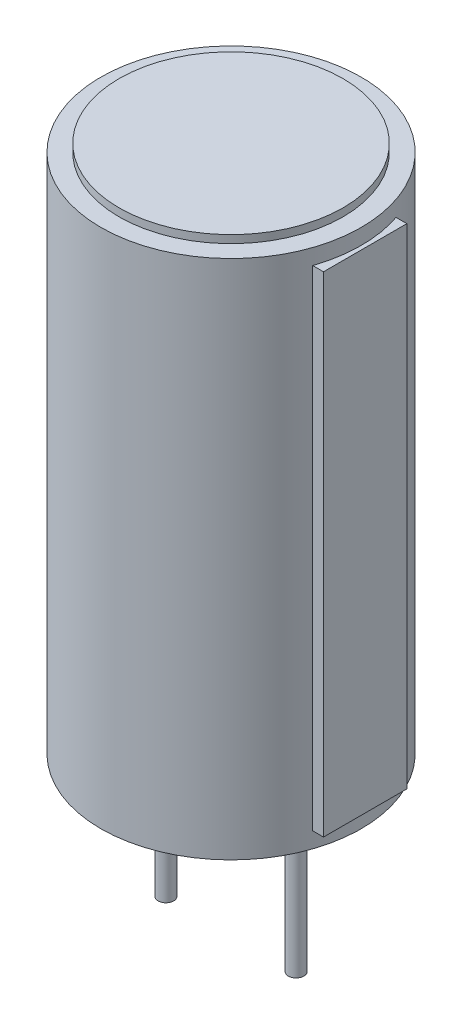
ISO-10303-21;
HEADER;
FILE_DESCRIPTION(('STEP AP214'),'2;1');
FILE_NAME('part.step','',(''),(''),'','','');
FILE_SCHEMA(('AUTOMOTIVE_DESIGN { 1 0 10303 214 1 1 1 1 }'));
ENDSEC;
DATA;
#1=APPLICATION_CONTEXT('core data for automotive mechanical design processes');
#2=APPLICATION_PROTOCOL_DEFINITION('international standard','automotive_design',2000,#1);
#3=PRODUCT_CONTEXT('',#1,'mechanical');
#4=PRODUCT('Part','Part','',(#3));
#5=PRODUCT_RELATED_PRODUCT_CATEGORY('part','',(#4));
#6=PRODUCT_DEFINITION_FORMATION('','',#4);
#7=PRODUCT_DEFINITION_CONTEXT('part definition',#1,'design');
#8=PRODUCT_DEFINITION('design','',#6,#7);
#9=PRODUCT_DEFINITION_SHAPE('','',#8);
#10=(LENGTH_UNIT() NAMED_UNIT(*) SI_UNIT(.MILLI.,.METRE.));
#11=(NAMED_UNIT(*) PLANE_ANGLE_UNIT() SI_UNIT($,.RADIAN.));
#12=(NAMED_UNIT(*) SI_UNIT($,.STERADIAN.) SOLID_ANGLE_UNIT());
#13=UNCERTAINTY_MEASURE_WITH_UNIT(LENGTH_MEASURE(1.E-05),#10,'distance_accuracy_value','');
#14=(GEOMETRIC_REPRESENTATION_CONTEXT(3) GLOBAL_UNCERTAINTY_ASSIGNED_CONTEXT((#13)) GLOBAL_UNIT_ASSIGNED_CONTEXT((#10,
#11,#12)) REPRESENTATION_CONTEXT('',''));
#15=CARTESIAN_POINT('',(0.,0.,0.));
#16=DIRECTION('',(0.,0.,1.));
#17=DIRECTION('',(1.,0.,0.));
#18=AXIS2_PLACEMENT_3D('',#15,#16,#17);
#19=CARTESIAN_POINT('',(2.5,0.,0.));
#20=DIRECTION('',(0.,-1.,0.));
#21=DIRECTION('',(0.,0.,-1.));
#22=AXIS2_PLACEMENT_3D('',#19,#20,#21);
#23=CYLINDRICAL_SURFACE('',#22,0.3);
#24=CARTESIAN_POINT('',(2.5,0.,0.));
#25=DIRECTION('',(0.,1.,0.));
#26=DIRECTION('',(0.,0.,1.));
#27=AXIS2_PLACEMENT_3D('',#24,#25,#26);
#28=CIRCLE('',#27,0.3);
#29=CARTESIAN_POINT('',(2.5,0.,0.3));
#30=VERTEX_POINT('',#29);
#31=EDGE_CURVE('E59',#30,#30,#28,.T.);
#32=ORIENTED_EDGE('',*,*,#31,.F.);
#33=EDGE_LOOP('',(#32));
#34=FACE_BOUND('',#33,.T.);
#35=CARTESIAN_POINT('',(2.5,-6.,0.));
#36=DIRECTION('',(0.,1.,0.));
#37=DIRECTION('',(0.,0.,1.));
#38=AXIS2_PLACEMENT_3D('',#35,#36,#37);
#39=CIRCLE('',#38,0.3);
#40=CARTESIAN_POINT('',(2.5,-6.,0.3));
#41=VERTEX_POINT('',#40);
#42=EDGE_CURVE('E11',#41,#41,#39,.T.);
#43=ORIENTED_EDGE('',*,*,#42,.T.);
#44=EDGE_LOOP('',(#43));
#45=FACE_BOUND('',#44,.T.);
#46=ADVANCED_FACE('F53',(#34,#45),#23,.T.);
#47=CARTESIAN_POINT('',(2.5,0.,0.));
#48=DIRECTION('',(0.,1.,0.));
#49=DIRECTION('',(0.,0.,1.));
#50=AXIS2_PLACEMENT_3D('',#47,#48,#49);
#51=PLANE('',#50);
#52=ORIENTED_EDGE('',*,*,#31,.T.);
#53=EDGE_LOOP('',(#52));
#54=FACE_BOUND('',#53,.T.);
#55=ADVANCED_FACE('F57',(#54),#51,.T.);
#56=CARTESIAN_POINT('',(2.5,-6.,0.));
#57=DIRECTION('',(0.,1.,0.));
#58=DIRECTION('',(0.,0.,1.));
#59=AXIS2_PLACEMENT_3D('',#56,#57,#58);
#60=PLANE('',#59);
#61=ORIENTED_EDGE('',*,*,#42,.F.);
#62=EDGE_LOOP('',(#61));
#63=FACE_BOUND('',#62,.T.);
#64=ADVANCED_FACE('F71',(#63),#60,.F.);
#65=CLOSED_SHELL('',(#46,#55,#64));
#66=MANIFOLD_SOLID_BREP('B2',#65);
#67=CARTESIAN_POINT('',(-2.5,0.,0.));
#68=DIRECTION('',(0.,-1.,0.));
#69=DIRECTION('',(0.,0.,-1.));
#70=AXIS2_PLACEMENT_3D('',#67,#68,#69);
#71=CYLINDRICAL_SURFACE('',#70,0.3);
#72=CARTESIAN_POINT('',(-2.5,0.,0.));
#73=DIRECTION('',(0.,1.,0.));
#74=DIRECTION('',(0.,0.,1.));
#75=AXIS2_PLACEMENT_3D('',#72,#73,#74);
#76=CIRCLE('',#75,0.3);
#77=CARTESIAN_POINT('',(-2.5,0.,0.3));
#78=VERTEX_POINT('',#77);
#79=EDGE_CURVE('E52',#78,#78,#76,.T.);
#80=ORIENTED_EDGE('',*,*,#79,.F.);
#81=EDGE_LOOP('',(#80));
#82=FACE_BOUND('',#81,.T.);
#83=CARTESIAN_POINT('',(-2.5,-6.,0.));
#84=DIRECTION('',(0.,1.,0.));
#85=DIRECTION('',(0.,0.,1.));
#86=AXIS2_PLACEMENT_3D('',#83,#84,#85);
#87=CIRCLE('',#86,0.3);
#88=CARTESIAN_POINT('',(-2.5,-6.,0.3));
#89=VERTEX_POINT('',#88);
#90=EDGE_CURVE('E117',#89,#89,#87,.T.);
#91=ORIENTED_EDGE('',*,*,#90,.T.);
#92=EDGE_LOOP('',(#91));
#93=FACE_BOUND('',#92,.T.);
#94=ADVANCED_FACE('F116',(#82,#93),#71,.T.);
#95=CARTESIAN_POINT('',(-2.5,0.,0.));
#96=DIRECTION('',(0.,1.,0.));
#97=DIRECTION('',(0.,0.,1.));
#98=AXIS2_PLACEMENT_3D('',#95,#96,#97);
#99=PLANE('',#98);
#100=ORIENTED_EDGE('',*,*,#79,.T.);
#101=EDGE_LOOP('',(#100));
#102=FACE_BOUND('',#101,.T.);
#103=ADVANCED_FACE('F131',(#102),#99,.T.);
#104=CARTESIAN_POINT('',(-2.5,-6.,0.));
#105=DIRECTION('',(0.,1.,0.));
#106=DIRECTION('',(0.,0.,1.));
#107=AXIS2_PLACEMENT_3D('',#104,#105,#106);
#108=PLANE('',#107);
#109=ORIENTED_EDGE('',*,*,#90,.F.);
#110=EDGE_LOOP('',(#109));
#111=FACE_BOUND('',#110,.T.);
#112=ADVANCED_FACE('F128',(#111),#108,.F.);
#113=CLOSED_SHELL('',(#94,#103,#112));
#114=MANIFOLD_SOLID_BREP('B6',#113);
#115=CARTESIAN_POINT('',(4.6,19.4,-1.6));
#116=DIRECTION('',(1.,0.,0.));
#117=DIRECTION('',(0.,0.,-1.));
#118=AXIS2_PLACEMENT_3D('',#115,#116,#117);
#119=PLANE('',#118);
#120=DIRECTION('',(0.,0.,1.));
#121=VECTOR('',#120,1.);
#122=CARTESIAN_POINT('',(4.6,0.6,-1.6));
#123=LINE('',#122,#121);
#124=CARTESIAN_POINT('',(4.6,0.6,-1.6));
#125=VERTEX_POINT('',#124);
#126=CARTESIAN_POINT('',(4.6,0.6,1.6));
#127=VERTEX_POINT('',#126);
#128=EDGE_CURVE('E244',#125,#127,#123,.T.);
#129=ORIENTED_EDGE('',*,*,#128,.T.);
#130=DIRECTION('',(0.,-1.,0.));
#131=VECTOR('',#130,1.);
#132=CARTESIAN_POINT('',(4.6,19.4,1.6));
#133=LINE('',#132,#131);
#134=CARTESIAN_POINT('',(4.6,19.4,1.6));
#135=VERTEX_POINT('',#134);
#136=EDGE_CURVE('E113',#135,#127,#133,.T.);
#137=ORIENTED_EDGE('',*,*,#136,.F.);
#138=DIRECTION('',(0.,0.,1.));
#139=VECTOR('',#138,1.);
#140=CARTESIAN_POINT('',(4.6,19.4,-1.6));
#141=LINE('',#140,#139);
#142=CARTESIAN_POINT('',(4.6,19.4,-1.6));
#143=VERTEX_POINT('',#142);
#144=EDGE_CURVE('E228',#143,#135,#141,.T.);
#145=ORIENTED_EDGE('',*,*,#144,.F.);
#146=DIRECTION('',(0.,-1.,0.));
#147=VECTOR('',#146,1.);
#148=CARTESIAN_POINT('',(4.6,19.4,-1.6));
#149=LINE('',#148,#147);
#150=EDGE_CURVE('E240',#143,#125,#149,.T.);
#151=ORIENTED_EDGE('',*,*,#150,.T.);
#152=EDGE_LOOP('',(#129,#137,#145,#151));
#153=FACE_BOUND('',#152,.T.);
#154=ADVANCED_FACE('F179',(#153),#119,.F.);
#155=CARTESIAN_POINT('',(4.6,19.4,1.6));
#156=DIRECTION('',(0.,0.,-1.));
#157=DIRECTION('',(-1.,0.,0.));
#158=AXIS2_PLACEMENT_3D('',#155,#156,#157);
#159=PLANE('',#158);
#160=DIRECTION('',(1.,0.,0.));
#161=VECTOR('',#160,1.);
#162=CARTESIAN_POINT('',(4.6,0.6,1.6));
#163=LINE('',#162,#161);
#164=CARTESIAN_POINT('',(5.15,0.6,1.6));
#165=VERTEX_POINT('',#164);
#166=EDGE_CURVE('E234',#127,#165,#163,.T.);
#167=ORIENTED_EDGE('',*,*,#166,.T.);
#168=DIRECTION('',(0.,-1.,0.));
#169=VECTOR('',#168,1.);
#170=CARTESIAN_POINT('',(5.15,19.4,1.6));
#171=LINE('',#170,#169);
#172=CARTESIAN_POINT('',(5.15,19.4,1.6));
#173=VERTEX_POINT('',#172);
#174=EDGE_CURVE('E189',#173,#165,#171,.T.);
#175=ORIENTED_EDGE('',*,*,#174,.F.);
#176=DIRECTION('',(1.,0.,0.));
#177=VECTOR('',#176,1.);
#178=CARTESIAN_POINT('',(4.6,19.4,1.6));
#179=LINE('',#178,#177);
#180=EDGE_CURVE('E221',#135,#173,#179,.T.);
#181=ORIENTED_EDGE('',*,*,#180,.F.);
#182=ORIENTED_EDGE('',*,*,#136,.T.);
#183=EDGE_LOOP('',(#167,#175,#181,#182));
#184=FACE_BOUND('',#183,.T.);
#185=ADVANCED_FACE('F235',(#184),#159,.F.);
#186=CARTESIAN_POINT('',(5.15,19.4,-1.6));
#187=DIRECTION('',(-1.,0.,0.));
#188=DIRECTION('',(0.,0.,1.));
#189=AXIS2_PLACEMENT_3D('',#186,#187,#188);
#190=PLANE('',#189);
#191=DIRECTION('',(0.,0.,-1.));
#192=VECTOR('',#191,1.);
#193=CARTESIAN_POINT('',(5.15,0.6,-1.6));
#194=LINE('',#193,#192);
#195=CARTESIAN_POINT('',(5.15,0.6,-1.6));
#196=VERTEX_POINT('',#195);
#197=EDGE_CURVE('E211',#165,#196,#194,.T.);
#198=ORIENTED_EDGE('',*,*,#197,.T.);
#199=DIRECTION('',(0.,-1.,0.));
#200=VECTOR('',#199,1.);
#201=CARTESIAN_POINT('',(5.15,19.4,-1.6));
#202=LINE('',#201,#200);
#203=CARTESIAN_POINT('',(5.15,19.4,-1.6));
#204=VERTEX_POINT('',#203);
#205=EDGE_CURVE('E231',#204,#196,#202,.T.);
#206=ORIENTED_EDGE('',*,*,#205,.F.);
#207=DIRECTION('',(0.,0.,-1.));
#208=VECTOR('',#207,1.);
#209=CARTESIAN_POINT('',(5.15,19.4,-1.6));
#210=LINE('',#209,#208);
#211=EDGE_CURVE('E226',#173,#204,#210,.T.);
#212=ORIENTED_EDGE('',*,*,#211,.F.);
#213=ORIENTED_EDGE('',*,*,#174,.T.);
#214=EDGE_LOOP('',(#198,#206,#212,#213));
#215=FACE_BOUND('',#214,.T.);
#216=ADVANCED_FACE('F233',(#215),#190,.F.);
#217=CARTESIAN_POINT('',(4.6,19.4,-1.6));
#218=DIRECTION('',(0.,0.,1.));
#219=DIRECTION('',(1.,0.,0.));
#220=AXIS2_PLACEMENT_3D('',#217,#218,#219);
#221=PLANE('',#220);
#222=DIRECTION('',(-1.,0.,0.));
#223=VECTOR('',#222,1.);
#224=CARTESIAN_POINT('',(4.6,0.6,-1.6));
#225=LINE('',#224,#223);
#226=EDGE_CURVE('E220',#196,#125,#225,.T.);
#227=ORIENTED_EDGE('',*,*,#226,.T.);
#228=ORIENTED_EDGE('',*,*,#150,.F.);
#229=DIRECTION('',(-1.,0.,0.));
#230=VECTOR('',#229,1.);
#231=CARTESIAN_POINT('',(4.6,19.4,-1.6));
#232=LINE('',#231,#230);
#233=EDGE_CURVE('E191',#204,#143,#232,.T.);
#234=ORIENTED_EDGE('',*,*,#233,.F.);
#235=ORIENTED_EDGE('',*,*,#205,.T.);
#236=EDGE_LOOP('',(#227,#228,#234,#235));
#237=FACE_BOUND('',#236,.T.);
#238=ADVANCED_FACE('F249',(#237),#221,.F.);
#239=CARTESIAN_POINT('',(0.,19.4,0.));
#240=DIRECTION('',(0.,1.,0.));
#241=DIRECTION('',(0.,0.,1.));
#242=AXIS2_PLACEMENT_3D('',#239,#240,#241);
#243=PLANE('',#242);
#244=ORIENTED_EDGE('',*,*,#144,.T.);
#245=ORIENTED_EDGE('',*,*,#180,.T.);
#246=ORIENTED_EDGE('',*,*,#211,.T.);
#247=ORIENTED_EDGE('',*,*,#233,.T.);
#248=EDGE_LOOP('',(#244,#245,#246,#247));
#249=FACE_BOUND('',#248,.T.);
#250=ADVANCED_FACE('F223',(#249),#243,.T.);
#251=CARTESIAN_POINT('',(0.,0.6,0.));
#252=DIRECTION('',(0.,1.,0.));
#253=DIRECTION('',(0.,0.,1.));
#254=AXIS2_PLACEMENT_3D('',#251,#252,#253);
#255=PLANE('',#254);
#256=ORIENTED_EDGE('',*,*,#128,.F.);
#257=ORIENTED_EDGE('',*,*,#226,.F.);
#258=ORIENTED_EDGE('',*,*,#197,.F.);
#259=ORIENTED_EDGE('',*,*,#166,.F.);
#260=EDGE_LOOP('',(#256,#257,#258,#259));
#261=FACE_BOUND('',#260,.T.);
#262=ADVANCED_FACE('F253',(#261),#255,.F.);
#263=CLOSED_SHELL('',(#154,#185,#216,#238,#250,#262));
#264=MANIFOLD_SOLID_BREP('B48',#263);
#265=CARTESIAN_POINT('',(0.,20.3,0.));
#266=DIRECTION('',(0.,-1.,0.));
#267=DIRECTION('',(0.,0.,-1.));
#268=AXIS2_PLACEMENT_3D('',#265,#266,#267);
#269=CYLINDRICAL_SURFACE('',#268,4.3);
#270=CARTESIAN_POINT('',(0.,20.3,0.));
#271=DIRECTION('',(0.,1.,0.));
#272=DIRECTION('',(0.,0.,1.));
#273=AXIS2_PLACEMENT_3D('',#270,#271,#272);
#274=CIRCLE('',#273,4.3);
#275=CARTESIAN_POINT('',(0.,20.3,4.3));
#276=VERTEX_POINT('',#275);
#277=EDGE_CURVE('E180',#276,#276,#274,.T.);
#278=ORIENTED_EDGE('',*,*,#277,.F.);
#279=EDGE_LOOP('',(#278));
#280=FACE_BOUND('',#279,.T.);
#281=CARTESIAN_POINT('',(0.,20.,0.));
#282=DIRECTION('',(0.,1.,0.));
#283=DIRECTION('',(0.,0.,1.));
#284=AXIS2_PLACEMENT_3D('',#281,#282,#283);
#285=CIRCLE('',#284,4.3);
#286=CARTESIAN_POINT('',(0.,20.,4.3));
#287=VERTEX_POINT('',#286);
#288=EDGE_CURVE('E339',#287,#287,#285,.T.);
#289=ORIENTED_EDGE('',*,*,#288,.T.);
#290=EDGE_LOOP('',(#289));
#291=FACE_BOUND('',#290,.T.);
#292=ADVANCED_FACE('F334',(#280,#291),#269,.T.);
#293=CARTESIAN_POINT('',(0.,20.3,0.));
#294=DIRECTION('',(0.,1.,0.));
#295=DIRECTION('',(0.,0.,1.));
#296=AXIS2_PLACEMENT_3D('',#293,#294,#295);
#297=PLANE('',#296);
#298=ORIENTED_EDGE('',*,*,#277,.T.);
#299=EDGE_LOOP('',(#298));
#300=FACE_BOUND('',#299,.T.);
#301=ADVANCED_FACE('F346',(#300),#297,.T.);
#302=CARTESIAN_POINT('',(0.,20.,0.));
#303=DIRECTION('',(0.,1.,0.));
#304=DIRECTION('',(0.,0.,1.));
#305=AXIS2_PLACEMENT_3D('',#302,#303,#304);
#306=PLANE('',#305);
#307=ORIENTED_EDGE('',*,*,#288,.F.);
#308=EDGE_LOOP('',(#307));
#309=FACE_BOUND('',#308,.T.);
#310=ADVANCED_FACE('F347',(#309),#306,.F.);
#311=CLOSED_SHELL('',(#292,#301,#310));
#312=MANIFOLD_SOLID_BREP('B108',#311);
#313=CARTESIAN_POINT('',(0.,20.,0.));
#314=DIRECTION('',(0.,-1.,0.));
#315=DIRECTION('',(0.,0.,-1.));
#316=AXIS2_PLACEMENT_3D('',#313,#314,#315);
#317=CYLINDRICAL_SURFACE('',#316,5.);
#318=CARTESIAN_POINT('',(0.,20.,0.));
#319=DIRECTION('',(0.,1.,0.));
#320=DIRECTION('',(0.,0.,1.));
#321=AXIS2_PLACEMENT_3D('',#318,#319,#320);
#322=CIRCLE('',#321,5.);
#323=CARTESIAN_POINT('',(0.,20.,5.));
#324=VERTEX_POINT('',#323);
#325=EDGE_CURVE('E335',#324,#324,#322,.T.);
#326=ORIENTED_EDGE('',*,*,#325,.F.);
#327=EDGE_LOOP('',(#326));
#328=FACE_BOUND('',#327,.T.);
#329=CARTESIAN_POINT('',(0.,0.,0.));
#330=DIRECTION('',(0.,1.,0.));
#331=DIRECTION('',(0.,0.,1.));
#332=AXIS2_PLACEMENT_3D('',#329,#330,#331);
#333=CIRCLE('',#332,5.);
#334=CARTESIAN_POINT('',(0.,0.,5.));
#335=VERTEX_POINT('',#334);
#336=EDGE_CURVE('E386',#335,#335,#333,.T.);
#337=ORIENTED_EDGE('',*,*,#336,.T.);
#338=EDGE_LOOP('',(#337));
#339=FACE_BOUND('',#338,.T.);
#340=ADVANCED_FACE('F387',(#328,#339),#317,.T.);
#341=CARTESIAN_POINT('',(0.,20.,0.));
#342=DIRECTION('',(0.,1.,0.));
#343=DIRECTION('',(0.,0.,1.));
#344=AXIS2_PLACEMENT_3D('',#341,#342,#343);
#345=PLANE('',#344);
#346=ORIENTED_EDGE('',*,*,#325,.T.);
#347=EDGE_LOOP('',(#346));
#348=FACE_BOUND('',#347,.T.);
#349=ADVANCED_FACE('F402',(#348),#345,.T.);
#350=CARTESIAN_POINT('',(0.,0.,0.));
#351=DIRECTION('',(0.,1.,0.));
#352=DIRECTION('',(0.,0.,1.));
#353=AXIS2_PLACEMENT_3D('',#350,#351,#352);
#354=PLANE('',#353);
#355=ORIENTED_EDGE('',*,*,#336,.F.);
#356=EDGE_LOOP('',(#355));
#357=FACE_BOUND('',#356,.T.);
#358=ADVANCED_FACE('F396',(#357),#354,.F.);
#359=CLOSED_SHELL('',(#340,#349,#358));
#360=MANIFOLD_SOLID_BREP('B171',#359);
#361=ADVANCED_BREP_SHAPE_REPRESENTATION('',(#18,#66,#114,#264,#312,#360),#14);
#362=SHAPE_DEFINITION_REPRESENTATION(#9,#361);
ENDSEC;
END-ISO-10303-21;
